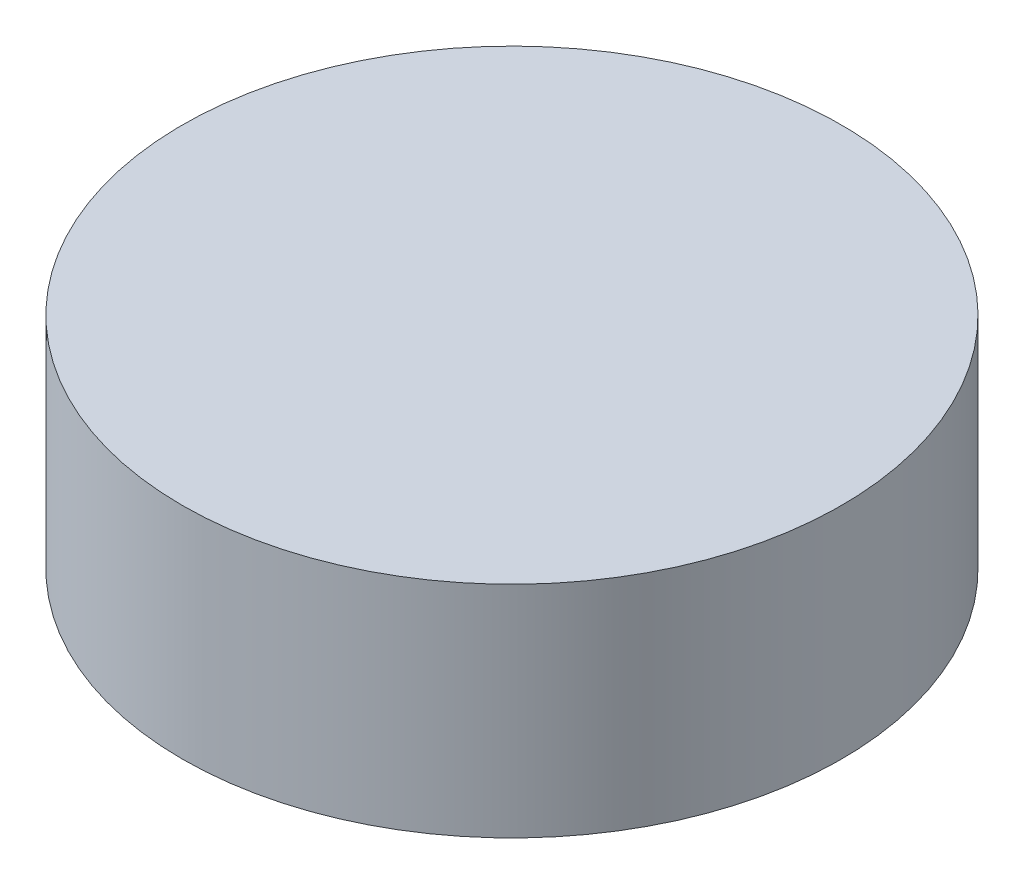
ISO-10303-21;
HEADER;
FILE_DESCRIPTION(('STEP AP214'),'2;1');
FILE_NAME('part.step','',(''),(''),'','','');
FILE_SCHEMA(('AUTOMOTIVE_DESIGN { 1 0 10303 214 1 1 1 1 }'));
ENDSEC;
DATA;
#1=APPLICATION_CONTEXT('core data for automotive mechanical design processes');
#2=APPLICATION_PROTOCOL_DEFINITION('international standard','automotive_design',2000,#1);
#3=PRODUCT_CONTEXT('',#1,'mechanical');
#4=PRODUCT('Part','Part','',(#3));
#5=PRODUCT_RELATED_PRODUCT_CATEGORY('part','',(#4));
#6=PRODUCT_DEFINITION_FORMATION('','',#4);
#7=PRODUCT_DEFINITION_CONTEXT('part definition',#1,'design');
#8=PRODUCT_DEFINITION('design','',#6,#7);
#9=PRODUCT_DEFINITION_SHAPE('','',#8);
#10=(LENGTH_UNIT() NAMED_UNIT(*) SI_UNIT(.MILLI.,.METRE.));
#11=(NAMED_UNIT(*) PLANE_ANGLE_UNIT() SI_UNIT($,.RADIAN.));
#12=(NAMED_UNIT(*) SI_UNIT($,.STERADIAN.) SOLID_ANGLE_UNIT());
#13=UNCERTAINTY_MEASURE_WITH_UNIT(LENGTH_MEASURE(1.E-05),#10,'distance_accuracy_value','');
#14=(GEOMETRIC_REPRESENTATION_CONTEXT(3) GLOBAL_UNCERTAINTY_ASSIGNED_CONTEXT((#13)) GLOBAL_UNIT_ASSIGNED_CONTEXT((#10,
#11,#12)) REPRESENTATION_CONTEXT('',''));
#15=CARTESIAN_POINT('',(0.,0.,0.));
#16=DIRECTION('',(0.,0.,1.));
#17=DIRECTION('',(1.,0.,0.));
#18=AXIS2_PLACEMENT_3D('',#15,#16,#17);
#19=CARTESIAN_POINT('',(0.,20.,0.));
#20=DIRECTION('',(0.,-1.,0.));
#21=DIRECTION('',(0.,0.,-1.));
#22=AXIS2_PLACEMENT_3D('',#19,#20,#21);
#23=CYLINDRICAL_SURFACE('',#22,30.);
#24=CARTESIAN_POINT('',(0.,20.,0.));
#25=DIRECTION('',(0.,1.,0.));
#26=DIRECTION('',(0.,0.,1.));
#27=AXIS2_PLACEMENT_3D('',#24,#25,#26);
#28=CIRCLE('',#27,30.);
#29=CARTESIAN_POINT('',(0.,20.,30.));
#30=VERTEX_POINT('',#29);
#31=EDGE_CURVE('E10',#30,#30,#28,.T.);
#32=ORIENTED_EDGE('',*,*,#31,.F.);
#33=EDGE_LOOP('',(#32));
#34=FACE_BOUND('',#33,.T.);
#35=CARTESIAN_POINT('',(0.,0.,0.));
#36=DIRECTION('',(0.,1.,0.));
#37=DIRECTION('',(0.,0.,1.));
#38=AXIS2_PLACEMENT_3D('',#35,#36,#37);
#39=CIRCLE('',#38,30.);
#40=CARTESIAN_POINT('',(0.,0.,30.));
#41=VERTEX_POINT('',#40);
#42=EDGE_CURVE('E46',#41,#41,#39,.T.);
#43=ORIENTED_EDGE('',*,*,#42,.T.);
#44=EDGE_LOOP('',(#43));
#45=FACE_BOUND('',#44,.T.);
#46=ADVANCED_FACE('F43',(#34,#45),#23,.T.);
#47=CARTESIAN_POINT('',(0.,20.,0.));
#48=DIRECTION('',(0.,1.,0.));
#49=DIRECTION('',(0.,0.,1.));
#50=AXIS2_PLACEMENT_3D('',#47,#48,#49);
#51=PLANE('',#50);
#52=ORIENTED_EDGE('',*,*,#31,.T.);
#53=EDGE_LOOP('',(#52));
#54=FACE_BOUND('',#53,.T.);
#55=ADVANCED_FACE('F60',(#54),#51,.T.);
#56=CARTESIAN_POINT('',(0.,0.,0.));
#57=DIRECTION('',(0.,1.,0.));
#58=DIRECTION('',(0.,0.,1.));
#59=AXIS2_PLACEMENT_3D('',#56,#57,#58);
#60=PLANE('',#59);
#61=ORIENTED_EDGE('',*,*,#42,.F.);
#62=EDGE_LOOP('',(#61));
#63=FACE_BOUND('',#62,.T.);
#64=ADVANCED_FACE('F58',(#63),#60,.F.);
#65=CLOSED_SHELL('',(#46,#55,#64));
#66=MANIFOLD_SOLID_BREP('B2',#65);
#67=ADVANCED_BREP_SHAPE_REPRESENTATION('',(#18,#66),#14);
#68=SHAPE_DEFINITION_REPRESENTATION(#9,#67);
ENDSEC;
END-ISO-10303-21;
